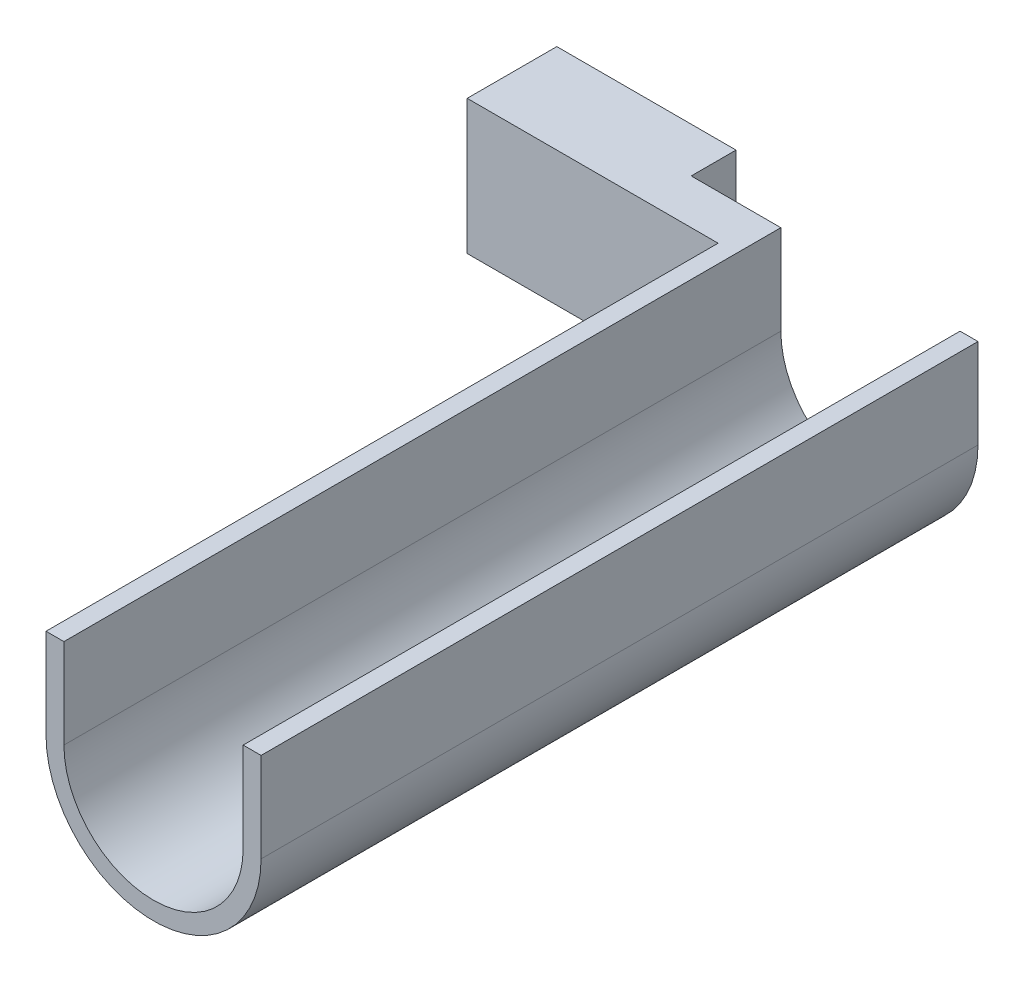
ISO-10303-21;
HEADER;
FILE_DESCRIPTION(('STEP AP214'),'2;1');
FILE_NAME('part.step','',(''),(''),'','','');
FILE_SCHEMA(('AUTOMOTIVE_DESIGN { 1 0 10303 214 1 1 1 1 }'));
ENDSEC;
DATA;
#1=APPLICATION_CONTEXT('core data for automotive mechanical design processes');
#2=APPLICATION_PROTOCOL_DEFINITION('international standard','automotive_design',2000,#1);
#3=PRODUCT_CONTEXT('',#1,'mechanical');
#4=PRODUCT('Part','Part','',(#3));
#5=PRODUCT_RELATED_PRODUCT_CATEGORY('part','',(#4));
#6=PRODUCT_DEFINITION_FORMATION('','',#4);
#7=PRODUCT_DEFINITION_CONTEXT('part definition',#1,'design');
#8=PRODUCT_DEFINITION('design','',#6,#7);
#9=PRODUCT_DEFINITION_SHAPE('','',#8);
#10=(LENGTH_UNIT() NAMED_UNIT(*) SI_UNIT(.MILLI.,.METRE.));
#11=(NAMED_UNIT(*) PLANE_ANGLE_UNIT() SI_UNIT($,.RADIAN.));
#12=(NAMED_UNIT(*) SI_UNIT($,.STERADIAN.) SOLID_ANGLE_UNIT());
#13=UNCERTAINTY_MEASURE_WITH_UNIT(LENGTH_MEASURE(1.E-05),#10,'distance_accuracy_value','');
#14=(GEOMETRIC_REPRESENTATION_CONTEXT(3) GLOBAL_UNCERTAINTY_ASSIGNED_CONTEXT((#13)) GLOBAL_UNIT_ASSIGNED_CONTEXT((#10,
#11,#12)) REPRESENTATION_CONTEXT('',''));
#15=CARTESIAN_POINT('',(0.,0.,0.));
#16=DIRECTION('',(0.,0.,1.));
#17=DIRECTION('',(1.,0.,0.));
#18=AXIS2_PLACEMENT_3D('',#15,#16,#17);
#19=CARTESIAN_POINT('',(0.,0.,0.));
#20=DIRECTION('',(0.,0.,1.));
#21=DIRECTION('',(1.,0.,0.));
#22=AXIS2_PLACEMENT_3D('',#19,#20,#21);
#23=PLANE('',#22);
#24=DIRECTION('',(0.,-1.,0.));
#25=VECTOR('',#24,1.);
#26=CARTESIAN_POINT('',(-20.,10.,0.));
#27=LINE('',#26,#25);
#28=CARTESIAN_POINT('',(-20.,10.,0.));
#29=VERTEX_POINT('',#28);
#30=CARTESIAN_POINT('',(-20.,-5.,0.));
#31=VERTEX_POINT('',#30);
#32=EDGE_CURVE('E57',#29,#31,#27,.T.);
#33=ORIENTED_EDGE('',*,*,#32,.F.);
#34=DIRECTION('',(-1.,0.,0.));
#35=VECTOR('',#34,1.);
#36=CARTESIAN_POINT('',(-12.,10.,0.));
#37=LINE('',#36,#35);
#38=CARTESIAN_POINT('',(-10.,10.,0.));
#39=VERTEX_POINT('',#38);
#40=EDGE_CURVE('E207',#39,#29,#37,.T.);
#41=ORIENTED_EDGE('',*,*,#40,.F.);
#42=DIRECTION('',(0.,1.,0.));
#43=VECTOR('',#42,1.);
#44=CARTESIAN_POINT('',(-10.,0.,0.));
#45=LINE('',#44,#43);
#46=CARTESIAN_POINT('',(-10.,0.,0.));
#47=VERTEX_POINT('',#46);
#48=EDGE_CURVE('E244',#47,#39,#45,.T.);
#49=ORIENTED_EDGE('',*,*,#48,.F.);
#50=CARTESIAN_POINT('',(0.,0.,0.));
#51=DIRECTION('',(0.,0.,-1.));
#52=DIRECTION('',(1.,0.,0.));
#53=AXIS2_PLACEMENT_3D('',#50,#51,#52);
#54=CIRCLE('',#53,10.);
#55=CARTESIAN_POINT('',(10.,0.,0.));
#56=VERTEX_POINT('',#55);
#57=EDGE_CURVE('E240',#56,#47,#54,.T.);
#58=ORIENTED_EDGE('',*,*,#57,.F.);
#59=DIRECTION('',(0.,-1.,0.));
#60=VECTOR('',#59,1.);
#61=CARTESIAN_POINT('',(10.,10.,0.));
#62=LINE('',#61,#60);
#63=CARTESIAN_POINT('',(10.,10.,0.));
#64=VERTEX_POINT('',#63);
#65=EDGE_CURVE('E237',#64,#56,#62,.T.);
#66=ORIENTED_EDGE('',*,*,#65,.F.);
#67=DIRECTION('',(-1.,0.,0.));
#68=VECTOR('',#67,1.);
#69=CARTESIAN_POINT('',(12.,10.,0.));
#70=LINE('',#69,#68);
#71=CARTESIAN_POINT('',(12.,10.,0.));
#72=VERTEX_POINT('',#71);
#73=EDGE_CURVE('E234',#72,#64,#70,.T.);
#74=ORIENTED_EDGE('',*,*,#73,.F.);
#75=DIRECTION('',(0.,1.,0.));
#76=VECTOR('',#75,1.);
#77=CARTESIAN_POINT('',(12.,0.,0.));
#78=LINE('',#77,#76);
#79=CARTESIAN_POINT('',(12.,0.,0.));
#80=VERTEX_POINT('',#79);
#81=EDGE_CURVE('E231',#80,#72,#78,.T.);
#82=ORIENTED_EDGE('',*,*,#81,.F.);
#83=CARTESIAN_POINT('',(0.,0.,0.));
#84=DIRECTION('',(0.,0.,1.));
#85=DIRECTION('',(1.,0.,0.));
#86=AXIS2_PLACEMENT_3D('',#83,#84,#85);
#87=CIRCLE('',#86,12.);
#88=CARTESIAN_POINT('',(-12.,0.,0.));
#89=VERTEX_POINT('',#88);
#90=EDGE_CURVE('E164',#89,#80,#87,.T.);
#91=ORIENTED_EDGE('',*,*,#90,.F.);
#92=DIRECTION('',(0.,1.,0.));
#93=VECTOR('',#92,1.);
#94=CARTESIAN_POINT('',(-12.,-5.,0.));
#95=LINE('',#94,#93);
#96=CARTESIAN_POINT('',(-12.,-5.,0.));
#97=VERTEX_POINT('',#96);
#98=EDGE_CURVE('E145',#97,#89,#95,.T.);
#99=ORIENTED_EDGE('',*,*,#98,.F.);
#100=DIRECTION('',(1.,0.,0.));
#101=VECTOR('',#100,1.);
#102=CARTESIAN_POINT('',(-20.,-5.,0.));
#103=LINE('',#102,#101);
#104=EDGE_CURVE('E154',#31,#97,#103,.T.);
#105=ORIENTED_EDGE('',*,*,#104,.F.);
#106=EDGE_LOOP('',(#33,#41,#49,#58,#66,#74,#82,#91,#99,#105));
#107=FACE_BOUND('',#106,.T.);
#108=ADVANCED_FACE('F41',(#107),#23,.F.);
#109=CARTESIAN_POINT('',(-12.,0.,80.));
#110=DIRECTION('',(1.,0.,0.));
#111=DIRECTION('',(0.,0.,-1.));
#112=AXIS2_PLACEMENT_3D('',#109,#110,#111);
#113=PLANE('',#112);
#114=DIRECTION('',(0.,1.,0.));
#115=VECTOR('',#114,1.);
#116=CARTESIAN_POINT('',(-12.,0.,5.));
#117=LINE('',#116,#115);
#118=CARTESIAN_POINT('',(-12.,0.,5.));
#119=VERTEX_POINT('',#118);
#120=CARTESIAN_POINT('',(-12.,10.,5.));
#121=VERTEX_POINT('',#120);
#122=EDGE_CURVE('E11',#119,#121,#117,.T.);
#123=ORIENTED_EDGE('',*,*,#122,.F.);
#124=DIRECTION('',(0.,0.,-1.));
#125=VECTOR('',#124,1.);
#126=CARTESIAN_POINT('',(-12.,0.,80.));
#127=LINE('',#126,#125);
#128=CARTESIAN_POINT('',(-12.,0.,80.));
#129=VERTEX_POINT('',#128);
#130=EDGE_CURVE('E228',#129,#119,#127,.T.);
#131=ORIENTED_EDGE('',*,*,#130,.F.);
#132=DIRECTION('',(0.,-1.,0.));
#133=VECTOR('',#132,1.);
#134=CARTESIAN_POINT('',(-12.,0.,80.));
#135=LINE('',#134,#133);
#136=CARTESIAN_POINT('',(-12.,10.,80.));
#137=VERTEX_POINT('',#136);
#138=EDGE_CURVE('E225',#137,#129,#135,.T.);
#139=ORIENTED_EDGE('',*,*,#138,.F.);
#140=DIRECTION('',(0.,0.,-1.));
#141=VECTOR('',#140,1.);
#142=CARTESIAN_POINT('',(-12.,10.,80.));
#143=LINE('',#142,#141);
#144=EDGE_CURVE('E65',#137,#121,#143,.T.);
#145=ORIENTED_EDGE('',*,*,#144,.T.);
#146=EDGE_LOOP('',(#123,#131,#139,#145));
#147=FACE_BOUND('',#146,.T.);
#148=ADVANCED_FACE('F284',(#147),#113,.F.);
#149=CARTESIAN_POINT('',(0.,0.,80.));
#150=DIRECTION('',(0.,0.,-1.));
#151=DIRECTION('',(-1.,0.,0.));
#152=AXIS2_PLACEMENT_3D('',#149,#150,#151);
#153=CYLINDRICAL_SURFACE('',#152,12.);
#154=ORIENTED_EDGE('',*,*,#90,.T.);
#155=DIRECTION('',(0.,0.,-1.));
#156=VECTOR('',#155,1.);
#157=CARTESIAN_POINT('',(12.,0.,80.));
#158=LINE('',#157,#156);
#159=CARTESIAN_POINT('',(12.,0.,80.));
#160=VERTEX_POINT('',#159);
#161=EDGE_CURVE('E50',#160,#80,#158,.T.);
#162=ORIENTED_EDGE('',*,*,#161,.F.);
#163=CARTESIAN_POINT('',(0.,0.,80.));
#164=DIRECTION('',(0.,0.,1.));
#165=DIRECTION('',(1.,0.,0.));
#166=AXIS2_PLACEMENT_3D('',#163,#164,#165);
#167=CIRCLE('',#166,12.);
#168=EDGE_CURVE('E202',#129,#160,#167,.T.);
#169=ORIENTED_EDGE('',*,*,#168,.F.);
#170=ORIENTED_EDGE('',*,*,#130,.T.);
#171=DIRECTION('',(0.,0.,-1.));
#172=VECTOR('',#171,1.);
#173=CARTESIAN_POINT('',(-12.,0.,80.));
#174=LINE('',#173,#172);
#175=EDGE_CURVE('E199',#119,#89,#174,.T.);
#176=ORIENTED_EDGE('',*,*,#175,.T.);
#177=EDGE_LOOP('',(#154,#162,#169,#170,#176));
#178=FACE_BOUND('',#177,.T.);
#179=ADVANCED_FACE('F43',(#178),#153,.T.);
#180=CARTESIAN_POINT('',(12.,0.,80.));
#181=DIRECTION('',(-1.,0.,0.));
#182=DIRECTION('',(0.,0.,1.));
#183=AXIS2_PLACEMENT_3D('',#180,#181,#182);
#184=PLANE('',#183);
#185=ORIENTED_EDGE('',*,*,#81,.T.);
#186=DIRECTION('',(0.,0.,-1.));
#187=VECTOR('',#186,1.);
#188=CARTESIAN_POINT('',(12.,10.,80.));
#189=LINE('',#188,#187);
#190=CARTESIAN_POINT('',(12.,10.,80.));
#191=VERTEX_POINT('',#190);
#192=EDGE_CURVE('E269',#191,#72,#189,.T.);
#193=ORIENTED_EDGE('',*,*,#192,.F.);
#194=DIRECTION('',(0.,1.,0.));
#195=VECTOR('',#194,1.);
#196=CARTESIAN_POINT('',(12.,0.,80.));
#197=LINE('',#196,#195);
#198=EDGE_CURVE('E206',#160,#191,#197,.T.);
#199=ORIENTED_EDGE('',*,*,#198,.F.);
#200=ORIENTED_EDGE('',*,*,#161,.T.);
#201=EDGE_LOOP('',(#185,#193,#199,#200));
#202=FACE_BOUND('',#201,.T.);
#203=ADVANCED_FACE('F276',(#202),#184,.F.);
#204=CARTESIAN_POINT('',(12.,10.,80.));
#205=DIRECTION('',(0.,-1.,0.));
#206=DIRECTION('',(0.,0.,-1.));
#207=AXIS2_PLACEMENT_3D('',#204,#205,#206);
#208=PLANE('',#207);
#209=ORIENTED_EDGE('',*,*,#73,.T.);
#210=DIRECTION('',(0.,0.,-1.));
#211=VECTOR('',#210,1.);
#212=CARTESIAN_POINT('',(10.,10.,80.));
#213=LINE('',#212,#211);
#214=CARTESIAN_POINT('',(10.,10.,80.));
#215=VERTEX_POINT('',#214);
#216=EDGE_CURVE('E265',#215,#64,#213,.T.);
#217=ORIENTED_EDGE('',*,*,#216,.F.);
#218=DIRECTION('',(-1.,0.,0.));
#219=VECTOR('',#218,1.);
#220=CARTESIAN_POINT('',(12.,10.,80.));
#221=LINE('',#220,#219);
#222=EDGE_CURVE('E210',#191,#215,#221,.T.);
#223=ORIENTED_EDGE('',*,*,#222,.F.);
#224=ORIENTED_EDGE('',*,*,#192,.T.);
#225=EDGE_LOOP('',(#209,#217,#223,#224));
#226=FACE_BOUND('',#225,.T.);
#227=ADVANCED_FACE('F328',(#226),#208,.F.);
#228=CARTESIAN_POINT('',(10.,10.,80.));
#229=DIRECTION('',(1.,0.,0.));
#230=DIRECTION('',(0.,1.,0.));
#231=AXIS2_PLACEMENT_3D('',#228,#229,#230);
#232=PLANE('',#231);
#233=ORIENTED_EDGE('',*,*,#65,.T.);
#234=DIRECTION('',(0.,0.,-1.));
#235=VECTOR('',#234,1.);
#236=CARTESIAN_POINT('',(10.,0.,80.));
#237=LINE('',#236,#235);
#238=CARTESIAN_POINT('',(10.,0.,80.));
#239=VERTEX_POINT('',#238);
#240=EDGE_CURVE('E261',#239,#56,#237,.T.);
#241=ORIENTED_EDGE('',*,*,#240,.F.);
#242=DIRECTION('',(0.,-1.,0.));
#243=VECTOR('',#242,1.);
#244=CARTESIAN_POINT('',(10.,10.,80.));
#245=LINE('',#244,#243);
#246=EDGE_CURVE('E213',#215,#239,#245,.T.);
#247=ORIENTED_EDGE('',*,*,#246,.F.);
#248=ORIENTED_EDGE('',*,*,#216,.T.);
#249=EDGE_LOOP('',(#233,#241,#247,#248));
#250=FACE_BOUND('',#249,.T.);
#251=ADVANCED_FACE('F324',(#250),#232,.F.);
#252=CARTESIAN_POINT('',(0.,0.,80.));
#253=DIRECTION('',(0.,0.,-1.));
#254=DIRECTION('',(-1.,0.,0.));
#255=AXIS2_PLACEMENT_3D('',#252,#253,#254);
#256=CYLINDRICAL_SURFACE('',#255,10.);
#257=ORIENTED_EDGE('',*,*,#57,.T.);
#258=DIRECTION('',(0.,0.,-1.));
#259=VECTOR('',#258,1.);
#260=CARTESIAN_POINT('',(-10.,0.,80.));
#261=LINE('',#260,#259);
#262=CARTESIAN_POINT('',(-10.,0.,80.));
#263=VERTEX_POINT('',#262);
#264=EDGE_CURVE('E258',#263,#47,#261,.T.);
#265=ORIENTED_EDGE('',*,*,#264,.F.);
#266=CARTESIAN_POINT('',(0.,0.,80.));
#267=DIRECTION('',(0.,0.,-1.));
#268=DIRECTION('',(1.,0.,0.));
#269=AXIS2_PLACEMENT_3D('',#266,#267,#268);
#270=CIRCLE('',#269,10.);
#271=EDGE_CURVE('E216',#239,#263,#270,.T.);
#272=ORIENTED_EDGE('',*,*,#271,.F.);
#273=ORIENTED_EDGE('',*,*,#240,.T.);
#274=EDGE_LOOP('',(#257,#265,#272,#273));
#275=FACE_BOUND('',#274,.T.);
#276=ADVANCED_FACE('F320',(#275),#256,.F.);
#277=CARTESIAN_POINT('',(-10.,0.,80.));
#278=DIRECTION('',(-1.,0.,0.));
#279=DIRECTION('',(0.,0.,1.));
#280=AXIS2_PLACEMENT_3D('',#277,#278,#279);
#281=PLANE('',#280);
#282=ORIENTED_EDGE('',*,*,#48,.T.);
#283=DIRECTION('',(0.,0.,-1.));
#284=VECTOR('',#283,1.);
#285=CARTESIAN_POINT('',(-10.,10.,80.));
#286=LINE('',#285,#284);
#287=CARTESIAN_POINT('',(-10.,10.,80.));
#288=VERTEX_POINT('',#287);
#289=EDGE_CURVE('E255',#288,#39,#286,.T.);
#290=ORIENTED_EDGE('',*,*,#289,.F.);
#291=DIRECTION('',(0.,1.,0.));
#292=VECTOR('',#291,1.);
#293=CARTESIAN_POINT('',(-10.,0.,80.));
#294=LINE('',#293,#292);
#295=EDGE_CURVE('E219',#263,#288,#294,.T.);
#296=ORIENTED_EDGE('',*,*,#295,.F.);
#297=ORIENTED_EDGE('',*,*,#264,.T.);
#298=EDGE_LOOP('',(#282,#290,#296,#297));
#299=FACE_BOUND('',#298,.T.);
#300=ADVANCED_FACE('F316',(#299),#281,.F.);
#301=CARTESIAN_POINT('',(-12.,10.,80.));
#302=DIRECTION('',(0.,-1.,0.));
#303=DIRECTION('',(0.,0.,-1.));
#304=AXIS2_PLACEMENT_3D('',#301,#302,#303);
#305=PLANE('',#304);
#306=ORIENTED_EDGE('',*,*,#40,.T.);
#307=DIRECTION('',(0.,0.,1.));
#308=VECTOR('',#307,1.);
#309=CARTESIAN_POINT('',(-20.,10.,-5.));
#310=LINE('',#309,#308);
#311=CARTESIAN_POINT('',(-20.,10.,-5.));
#312=VERTEX_POINT('',#311);
#313=EDGE_CURVE('E183',#312,#29,#310,.T.);
#314=ORIENTED_EDGE('',*,*,#313,.F.);
#315=DIRECTION('',(1.,0.,0.));
#316=VECTOR('',#315,1.);
#317=CARTESIAN_POINT('',(-40.,10.,-5.));
#318=LINE('',#317,#316);
#319=CARTESIAN_POINT('',(-40.,10.,-5.));
#320=VERTEX_POINT('',#319);
#321=EDGE_CURVE('E178',#320,#312,#318,.T.);
#322=ORIENTED_EDGE('',*,*,#321,.F.);
#323=DIRECTION('',(0.,0.,-1.));
#324=VECTOR('',#323,1.);
#325=CARTESIAN_POINT('',(-40.,10.,5.));
#326=LINE('',#325,#324);
#327=CARTESIAN_POINT('',(-40.,10.,5.));
#328=VERTEX_POINT('',#327);
#329=EDGE_CURVE('E196',#328,#320,#326,.T.);
#330=ORIENTED_EDGE('',*,*,#329,.F.);
#331=DIRECTION('',(1.,0.,0.));
#332=VECTOR('',#331,1.);
#333=CARTESIAN_POINT('',(-10.,10.,5.));
#334=LINE('',#333,#332);
#335=EDGE_CURVE('E192',#328,#121,#334,.T.);
#336=ORIENTED_EDGE('',*,*,#335,.T.);
#337=ORIENTED_EDGE('',*,*,#144,.F.);
#338=DIRECTION('',(-1.,0.,0.));
#339=VECTOR('',#338,1.);
#340=CARTESIAN_POINT('',(-12.,10.,80.));
#341=LINE('',#340,#339);
#342=EDGE_CURVE('E222',#288,#137,#341,.T.);
#343=ORIENTED_EDGE('',*,*,#342,.F.);
#344=ORIENTED_EDGE('',*,*,#289,.T.);
#345=EDGE_LOOP('',(#306,#314,#322,#330,#336,#337,#343,#344));
#346=FACE_BOUND('',#345,.T.);
#347=ADVANCED_FACE('F291',(#346),#305,.F.);
#348=CARTESIAN_POINT('',(0.,0.,80.));
#349=DIRECTION('',(0.,0.,1.));
#350=DIRECTION('',(1.,0.,0.));
#351=AXIS2_PLACEMENT_3D('',#348,#349,#350);
#352=PLANE('',#351);
#353=ORIENTED_EDGE('',*,*,#168,.T.);
#354=ORIENTED_EDGE('',*,*,#198,.T.);
#355=ORIENTED_EDGE('',*,*,#222,.T.);
#356=ORIENTED_EDGE('',*,*,#246,.T.);
#357=ORIENTED_EDGE('',*,*,#271,.T.);
#358=ORIENTED_EDGE('',*,*,#295,.T.);
#359=ORIENTED_EDGE('',*,*,#342,.T.);
#360=ORIENTED_EDGE('',*,*,#138,.T.);
#361=EDGE_LOOP('',(#353,#354,#355,#356,#357,#358,#359,#360));
#362=FACE_BOUND('',#361,.T.);
#363=ADVANCED_FACE('F286',(#362),#352,.T.);
#364=CARTESIAN_POINT('',(0.,0.,5.));
#365=DIRECTION('',(0.,0.,-1.));
#366=DIRECTION('',(-1.,0.,0.));
#367=AXIS2_PLACEMENT_3D('',#364,#365,#366);
#368=PLANE('',#367);
#369=DIRECTION('',(0.,1.,0.));
#370=VECTOR('',#369,1.);
#371=CARTESIAN_POINT('',(-40.,10.,5.));
#372=LINE('',#371,#370);
#373=CARTESIAN_POINT('',(-40.,-5.,5.));
#374=VERTEX_POINT('',#373);
#375=EDGE_CURVE('E188',#374,#328,#372,.T.);
#376=ORIENTED_EDGE('',*,*,#375,.F.);
#377=DIRECTION('',(-1.,0.,0.));
#378=VECTOR('',#377,1.);
#379=CARTESIAN_POINT('',(-12.,-5.,5.));
#380=LINE('',#379,#378);
#381=CARTESIAN_POINT('',(-12.,-5.,5.));
#382=VERTEX_POINT('',#381);
#383=EDGE_CURVE('E153',#382,#374,#380,.T.);
#384=ORIENTED_EDGE('',*,*,#383,.F.);
#385=DIRECTION('',(0.,1.,0.));
#386=VECTOR('',#385,1.);
#387=CARTESIAN_POINT('',(-12.,-5.,5.));
#388=LINE('',#387,#386);
#389=EDGE_CURVE('E148',#382,#119,#388,.T.);
#390=ORIENTED_EDGE('',*,*,#389,.T.);
#391=ORIENTED_EDGE('',*,*,#122,.T.);
#392=ORIENTED_EDGE('',*,*,#335,.F.);
#393=EDGE_LOOP('',(#376,#384,#390,#391,#392));
#394=FACE_BOUND('',#393,.T.);
#395=ADVANCED_FACE('F282',(#394),#368,.F.);
#396=CARTESIAN_POINT('',(-40.,10.,5.));
#397=DIRECTION('',(-1.,0.,0.));
#398=DIRECTION('',(0.,0.,1.));
#399=AXIS2_PLACEMENT_3D('',#396,#397,#398);
#400=PLANE('',#399);
#401=ORIENTED_EDGE('',*,*,#329,.T.);
#402=DIRECTION('',(0.,1.,0.));
#403=VECTOR('',#402,1.);
#404=CARTESIAN_POINT('',(-40.,10.,-5.));
#405=LINE('',#404,#403);
#406=CARTESIAN_POINT('',(-40.,-5.,-5.));
#407=VERTEX_POINT('',#406);
#408=EDGE_CURVE('E170',#407,#320,#405,.T.);
#409=ORIENTED_EDGE('',*,*,#408,.F.);
#410=DIRECTION('',(0.,0.,-1.));
#411=VECTOR('',#410,1.);
#412=CARTESIAN_POINT('',(-40.,-5.,5.));
#413=LINE('',#412,#411);
#414=EDGE_CURVE('E296',#374,#407,#413,.T.);
#415=ORIENTED_EDGE('',*,*,#414,.F.);
#416=ORIENTED_EDGE('',*,*,#375,.T.);
#417=EDGE_LOOP('',(#401,#409,#415,#416));
#418=FACE_BOUND('',#417,.T.);
#419=ADVANCED_FACE('F300',(#418),#400,.T.);
#420=CARTESIAN_POINT('',(-20.,10.,-5.));
#421=DIRECTION('',(-1.,0.,0.));
#422=DIRECTION('',(0.,0.,1.));
#423=AXIS2_PLACEMENT_3D('',#420,#421,#422);
#424=PLANE('',#423);
#425=ORIENTED_EDGE('',*,*,#32,.T.);
#426=DIRECTION('',(0.,0.,1.));
#427=VECTOR('',#426,1.);
#428=CARTESIAN_POINT('',(-20.,-5.,-5.));
#429=LINE('',#428,#427);
#430=CARTESIAN_POINT('',(-20.,-5.,-5.));
#431=VERTEX_POINT('',#430);
#432=EDGE_CURVE('E160',#431,#31,#429,.T.);
#433=ORIENTED_EDGE('',*,*,#432,.F.);
#434=DIRECTION('',(0.,-1.,0.));
#435=VECTOR('',#434,1.);
#436=CARTESIAN_POINT('',(-20.,10.,-5.));
#437=LINE('',#436,#435);
#438=EDGE_CURVE('E181',#312,#431,#437,.T.);
#439=ORIENTED_EDGE('',*,*,#438,.F.);
#440=ORIENTED_EDGE('',*,*,#313,.T.);
#441=EDGE_LOOP('',(#425,#433,#439,#440));
#442=FACE_BOUND('',#441,.T.);
#443=ADVANCED_FACE('F310',(#442),#424,.F.);
#444=CARTESIAN_POINT('',(0.,0.,-5.));
#445=DIRECTION('',(0.,0.,1.));
#446=DIRECTION('',(1.,0.,0.));
#447=AXIS2_PLACEMENT_3D('',#444,#445,#446);
#448=PLANE('',#447);
#449=ORIENTED_EDGE('',*,*,#408,.T.);
#450=ORIENTED_EDGE('',*,*,#321,.T.);
#451=ORIENTED_EDGE('',*,*,#438,.T.);
#452=DIRECTION('',(1.,0.,0.));
#453=VECTOR('',#452,1.);
#454=CARTESIAN_POINT('',(-40.,-5.,-5.));
#455=LINE('',#454,#453);
#456=EDGE_CURVE('E302',#407,#431,#455,.T.);
#457=ORIENTED_EDGE('',*,*,#456,.F.);
#458=EDGE_LOOP('',(#449,#450,#451,#457));
#459=FACE_BOUND('',#458,.T.);
#460=ADVANCED_FACE('F386',(#459),#448,.F.);
#461=CARTESIAN_POINT('',(-12.,-5.,0.));
#462=DIRECTION('',(-1.,0.,0.));
#463=DIRECTION('',(0.,0.,1.));
#464=AXIS2_PLACEMENT_3D('',#461,#462,#463);
#465=PLANE('',#464);
#466=ORIENTED_EDGE('',*,*,#175,.F.);
#467=ORIENTED_EDGE('',*,*,#389,.F.);
#468=DIRECTION('',(0.,0.,1.));
#469=VECTOR('',#468,1.);
#470=CARTESIAN_POINT('',(-12.,-5.,0.));
#471=LINE('',#470,#469);
#472=EDGE_CURVE('E141',#97,#382,#471,.T.);
#473=ORIENTED_EDGE('',*,*,#472,.F.);
#474=ORIENTED_EDGE('',*,*,#98,.T.);
#475=EDGE_LOOP('',(#466,#467,#473,#474));
#476=FACE_BOUND('',#475,.T.);
#477=ADVANCED_FACE('F143',(#476),#465,.F.);
#478=CARTESIAN_POINT('',(0.,-5.,0.));
#479=DIRECTION('',(0.,-1.,0.));
#480=DIRECTION('',(0.,0.,-1.));
#481=AXIS2_PLACEMENT_3D('',#478,#479,#480);
#482=PLANE('',#481);
#483=ORIENTED_EDGE('',*,*,#104,.T.);
#484=ORIENTED_EDGE('',*,*,#472,.T.);
#485=ORIENTED_EDGE('',*,*,#383,.T.);
#486=ORIENTED_EDGE('',*,*,#414,.T.);
#487=ORIENTED_EDGE('',*,*,#456,.T.);
#488=ORIENTED_EDGE('',*,*,#432,.T.);
#489=EDGE_LOOP('',(#483,#484,#485,#486,#487,#488));
#490=FACE_BOUND('',#489,.T.);
#491=ADVANCED_FACE('F157',(#490),#482,.T.);
#492=CLOSED_SHELL('',(#108,#148,#179,#203,#227,#251,#276,#300,#347,#363,#395,#419,#443,#460,
#477,#491));
#493=MANIFOLD_SOLID_BREP('B2',#492);
#494=ADVANCED_BREP_SHAPE_REPRESENTATION('',(#18,#493),#14);
#495=SHAPE_DEFINITION_REPRESENTATION(#9,#494);
ENDSEC;
END-ISO-10303-21;
